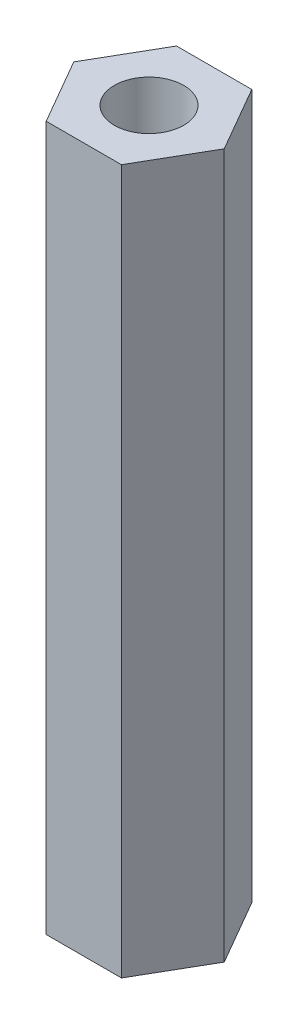
ISO-10303-21;
HEADER;
FILE_DESCRIPTION(('STEP AP214'),'2;1');
FILE_NAME('part.step','',(''),(''),'','','');
FILE_SCHEMA(('AUTOMOTIVE_DESIGN { 1 0 10303 214 1 1 1 1 }'));
ENDSEC;
DATA;
#1=APPLICATION_CONTEXT('core data for automotive mechanical design processes');
#2=APPLICATION_PROTOCOL_DEFINITION('international standard','automotive_design',2000,#1);
#3=PRODUCT_CONTEXT('',#1,'mechanical');
#4=PRODUCT('Part','Part','',(#3));
#5=PRODUCT_RELATED_PRODUCT_CATEGORY('part','',(#4));
#6=PRODUCT_DEFINITION_FORMATION('','',#4);
#7=PRODUCT_DEFINITION_CONTEXT('part definition',#1,'design');
#8=PRODUCT_DEFINITION('design','',#6,#7);
#9=PRODUCT_DEFINITION_SHAPE('','',#8);
#10=(LENGTH_UNIT() NAMED_UNIT(*) SI_UNIT(.MILLI.,.METRE.));
#11=(NAMED_UNIT(*) PLANE_ANGLE_UNIT() SI_UNIT($,.RADIAN.));
#12=(NAMED_UNIT(*) SI_UNIT($,.STERADIAN.) SOLID_ANGLE_UNIT());
#13=UNCERTAINTY_MEASURE_WITH_UNIT(LENGTH_MEASURE(1.E-05),#10,'distance_accuracy_value','');
#14=(GEOMETRIC_REPRESENTATION_CONTEXT(3) GLOBAL_UNCERTAINTY_ASSIGNED_CONTEXT((#13)) GLOBAL_UNIT_ASSIGNED_CONTEXT((#10,
#11,#12)) REPRESENTATION_CONTEXT('',''));
#15=CARTESIAN_POINT('',(0.,0.,0.));
#16=DIRECTION('',(0.,0.,1.));
#17=DIRECTION('',(1.,0.,0.));
#18=AXIS2_PLACEMENT_3D('',#15,#16,#17);
#19=CARTESIAN_POINT('',(0.,25.4,0.));
#20=DIRECTION('',(0.,1.,0.));
#21=DIRECTION('',(0.,0.,1.));
#22=AXIS2_PLACEMENT_3D('',#19,#20,#21);
#23=PLANE('',#22);
#24=DIRECTION('',(-0.5,0.,-0.866025403784439));
#25=VECTOR('',#24,1.);
#26=CARTESIAN_POINT('',(2.71354626519124,25.4,0.));
#27=LINE('',#26,#25);
#28=CARTESIAN_POINT('',(2.71354626519124,25.4,0.));
#29=VERTEX_POINT('',#28);
#30=CARTESIAN_POINT('',(1.35677313259562,25.4,-2.35));
#31=VERTEX_POINT('',#30);
#32=EDGE_CURVE('E129',#29,#31,#27,.T.);
#33=ORIENTED_EDGE('',*,*,#32,.T.);
#34=DIRECTION('',(-1.,0.,0.));
#35=VECTOR('',#34,1.);
#36=CARTESIAN_POINT('',(1.35677313259562,25.4,-2.35));
#37=LINE('',#36,#35);
#38=CARTESIAN_POINT('',(-1.35677313259562,25.4,-2.35));
#39=VERTEX_POINT('',#38);
#40=EDGE_CURVE('E87',#31,#39,#37,.T.);
#41=ORIENTED_EDGE('',*,*,#40,.T.);
#42=DIRECTION('',(-0.5,0.,0.866025403784439));
#43=VECTOR('',#42,1.);
#44=CARTESIAN_POINT('',(-1.35677313259562,25.4,-2.35));
#45=LINE('',#44,#43);
#46=CARTESIAN_POINT('',(-2.71354626519124,25.4,0.));
#47=VERTEX_POINT('',#46);
#48=EDGE_CURVE('E100',#39,#47,#45,.T.);
#49=ORIENTED_EDGE('',*,*,#48,.T.);
#50=DIRECTION('',(0.5,0.,0.866025403784439));
#51=VECTOR('',#50,1.);
#52=CARTESIAN_POINT('',(-2.71354626519124,25.4,0.));
#53=LINE('',#52,#51);
#54=CARTESIAN_POINT('',(-1.35677313259562,25.4,2.35));
#55=VERTEX_POINT('',#54);
#56=EDGE_CURVE('E94',#47,#55,#53,.T.);
#57=ORIENTED_EDGE('',*,*,#56,.T.);
#58=DIRECTION('',(1.,0.,0.));
#59=VECTOR('',#58,1.);
#60=CARTESIAN_POINT('',(-1.35677313259562,25.4,2.35));
#61=LINE('',#60,#59);
#62=CARTESIAN_POINT('',(1.35677313259562,25.4,2.35));
#63=VERTEX_POINT('',#62);
#64=EDGE_CURVE('E98',#55,#63,#61,.T.);
#65=ORIENTED_EDGE('',*,*,#64,.T.);
#66=DIRECTION('',(0.5,0.,-0.866025403784439));
#67=VECTOR('',#66,1.);
#68=CARTESIAN_POINT('',(1.35677313259562,25.4,2.35));
#69=LINE('',#68,#67);
#70=EDGE_CURVE('E50',#63,#29,#69,.T.);
#71=ORIENTED_EDGE('',*,*,#70,.T.);
#72=EDGE_LOOP('',(#33,#41,#49,#57,#65,#71));
#73=FACE_BOUND('',#72,.T.);
#74=CARTESIAN_POINT('',(0.,25.4,0.));
#75=DIRECTION('',(0.,1.,0.));
#76=DIRECTION('',(0.,0.,1.));
#77=AXIS2_PLACEMENT_3D('',#74,#75,#76);
#78=CIRCLE('',#77,1.25);
#79=CARTESIAN_POINT('',(0.,25.4,1.25));
#80=VERTEX_POINT('',#79);
#81=EDGE_CURVE('E122',#80,#80,#78,.T.);
#82=ORIENTED_EDGE('',*,*,#81,.F.);
#83=EDGE_LOOP('',(#82));
#84=FACE_BOUND('',#83,.T.);
#85=ADVANCED_FACE('F33',(#73,#84),#23,.T.);
#86=CARTESIAN_POINT('',(0.,0.,0.));
#87=DIRECTION('',(0.,1.,0.));
#88=DIRECTION('',(0.,0.,1.));
#89=AXIS2_PLACEMENT_3D('',#86,#87,#88);
#90=PLANE('',#89);
#91=DIRECTION('',(-0.5,0.,-0.866025403784439));
#92=VECTOR('',#91,1.);
#93=CARTESIAN_POINT('',(2.71354626519124,0.,0.));
#94=LINE('',#93,#92);
#95=CARTESIAN_POINT('',(2.71354626519124,0.,0.));
#96=VERTEX_POINT('',#95);
#97=CARTESIAN_POINT('',(1.35677313259562,0.,-2.35));
#98=VERTEX_POINT('',#97);
#99=EDGE_CURVE('E118',#96,#98,#94,.T.);
#100=ORIENTED_EDGE('',*,*,#99,.F.);
#101=DIRECTION('',(0.5,0.,-0.866025403784439));
#102=VECTOR('',#101,1.);
#103=CARTESIAN_POINT('',(1.35677313259562,0.,2.35));
#104=LINE('',#103,#102);
#105=CARTESIAN_POINT('',(1.35677313259562,0.,2.35));
#106=VERTEX_POINT('',#105);
#107=EDGE_CURVE('E79',#106,#96,#104,.T.);
#108=ORIENTED_EDGE('',*,*,#107,.F.);
#109=DIRECTION('',(1.,0.,0.));
#110=VECTOR('',#109,1.);
#111=CARTESIAN_POINT('',(-1.35677313259562,0.,2.35));
#112=LINE('',#111,#110);
#113=CARTESIAN_POINT('',(-1.35677313259562,0.,2.35));
#114=VERTEX_POINT('',#113);
#115=EDGE_CURVE('E73',#114,#106,#112,.T.);
#116=ORIENTED_EDGE('',*,*,#115,.F.);
#117=DIRECTION('',(0.5,0.,0.866025403784439));
#118=VECTOR('',#117,1.);
#119=CARTESIAN_POINT('',(-2.71354626519124,0.,0.));
#120=LINE('',#119,#118);
#121=CARTESIAN_POINT('',(-2.71354626519124,0.,0.));
#122=VERTEX_POINT('',#121);
#123=EDGE_CURVE('E108',#122,#114,#120,.T.);
#124=ORIENTED_EDGE('',*,*,#123,.F.);
#125=DIRECTION('',(-0.5,0.,0.866025403784439));
#126=VECTOR('',#125,1.);
#127=CARTESIAN_POINT('',(-1.35677313259562,0.,-2.35));
#128=LINE('',#127,#126);
#129=CARTESIAN_POINT('',(-1.35677313259562,0.,-2.35));
#130=VERTEX_POINT('',#129);
#131=EDGE_CURVE('E124',#130,#122,#128,.T.);
#132=ORIENTED_EDGE('',*,*,#131,.F.);
#133=DIRECTION('',(-1.,0.,0.));
#134=VECTOR('',#133,1.);
#135=CARTESIAN_POINT('',(1.35677313259562,0.,-2.35));
#136=LINE('',#135,#134);
#137=EDGE_CURVE('E121',#98,#130,#136,.T.);
#138=ORIENTED_EDGE('',*,*,#137,.F.);
#139=EDGE_LOOP('',(#100,#108,#116,#124,#132,#138));
#140=FACE_BOUND('',#139,.T.);
#141=CARTESIAN_POINT('',(0.,0.,0.));
#142=DIRECTION('',(0.,1.,0.));
#143=DIRECTION('',(0.,0.,1.));
#144=AXIS2_PLACEMENT_3D('',#141,#142,#143);
#145=CIRCLE('',#144,1.25);
#146=CARTESIAN_POINT('',(0.,0.,1.25));
#147=VERTEX_POINT('',#146);
#148=EDGE_CURVE('E222',#147,#147,#145,.T.);
#149=ORIENTED_EDGE('',*,*,#148,.T.);
#150=EDGE_LOOP('',(#149));
#151=FACE_BOUND('',#150,.T.);
#152=ADVANCED_FACE('F138',(#140,#151),#90,.F.);
#153=CARTESIAN_POINT('',(2.71354626519124,25.4,0.));
#154=DIRECTION('',(-0.866025403784439,0.,0.5));
#155=DIRECTION('',(0.5,0.,0.866025403784439));
#156=AXIS2_PLACEMENT_3D('',#153,#154,#155);
#157=PLANE('',#156);
#158=ORIENTED_EDGE('',*,*,#99,.T.);
#159=DIRECTION('',(0.,-1.,0.));
#160=VECTOR('',#159,1.);
#161=CARTESIAN_POINT('',(1.35677313259562,25.4,-2.35));
#162=LINE('',#161,#160);
#163=EDGE_CURVE('E11',#31,#98,#162,.T.);
#164=ORIENTED_EDGE('',*,*,#163,.F.);
#165=ORIENTED_EDGE('',*,*,#32,.F.);
#166=DIRECTION('',(0.,-1.,0.));
#167=VECTOR('',#166,1.);
#168=CARTESIAN_POINT('',(2.71354626519124,25.4,0.));
#169=LINE('',#168,#167);
#170=EDGE_CURVE('E114',#29,#96,#169,.T.);
#171=ORIENTED_EDGE('',*,*,#170,.T.);
#172=EDGE_LOOP('',(#158,#164,#165,#171));
#173=FACE_BOUND('',#172,.T.);
#174=ADVANCED_FACE('F35',(#173),#157,.F.);
#175=CARTESIAN_POINT('',(1.35677313259562,25.4,-2.35));
#176=DIRECTION('',(0.,0.,1.));
#177=DIRECTION('',(1.,0.,0.));
#178=AXIS2_PLACEMENT_3D('',#175,#176,#177);
#179=PLANE('',#178);
#180=ORIENTED_EDGE('',*,*,#137,.T.);
#181=DIRECTION('',(0.,-1.,0.));
#182=VECTOR('',#181,1.);
#183=CARTESIAN_POINT('',(-1.35677313259562,25.4,-2.35));
#184=LINE('',#183,#182);
#185=EDGE_CURVE('E42',#39,#130,#184,.T.);
#186=ORIENTED_EDGE('',*,*,#185,.F.);
#187=ORIENTED_EDGE('',*,*,#40,.F.);
#188=ORIENTED_EDGE('',*,*,#163,.T.);
#189=EDGE_LOOP('',(#180,#186,#187,#188));
#190=FACE_BOUND('',#189,.T.);
#191=ADVANCED_FACE('F163',(#190),#179,.F.);
#192=CARTESIAN_POINT('',(-1.35677313259562,25.4,-2.35));
#193=DIRECTION('',(0.866025403784439,0.,0.5));
#194=DIRECTION('',(0.5,0.,-0.866025403784439));
#195=AXIS2_PLACEMENT_3D('',#192,#193,#194);
#196=PLANE('',#195);
#197=ORIENTED_EDGE('',*,*,#131,.T.);
#198=DIRECTION('',(0.,-1.,0.));
#199=VECTOR('',#198,1.);
#200=CARTESIAN_POINT('',(-2.71354626519124,25.4,0.));
#201=LINE('',#200,#199);
#202=EDGE_CURVE('E109',#47,#122,#201,.T.);
#203=ORIENTED_EDGE('',*,*,#202,.F.);
#204=ORIENTED_EDGE('',*,*,#48,.F.);
#205=ORIENTED_EDGE('',*,*,#185,.T.);
#206=EDGE_LOOP('',(#197,#203,#204,#205));
#207=FACE_BOUND('',#206,.T.);
#208=ADVANCED_FACE('F135',(#207),#196,.F.);
#209=CARTESIAN_POINT('',(-2.71354626519124,25.4,0.));
#210=DIRECTION('',(0.866025403784439,0.,-0.5));
#211=DIRECTION('',(-0.5,0.,-0.866025403784439));
#212=AXIS2_PLACEMENT_3D('',#209,#210,#211);
#213=PLANE('',#212);
#214=ORIENTED_EDGE('',*,*,#123,.T.);
#215=DIRECTION('',(0.,-1.,0.));
#216=VECTOR('',#215,1.);
#217=CARTESIAN_POINT('',(-1.35677313259562,25.4,2.35));
#218=LINE('',#217,#216);
#219=EDGE_CURVE('E105',#55,#114,#218,.T.);
#220=ORIENTED_EDGE('',*,*,#219,.F.);
#221=ORIENTED_EDGE('',*,*,#56,.F.);
#222=ORIENTED_EDGE('',*,*,#202,.T.);
#223=EDGE_LOOP('',(#214,#220,#221,#222));
#224=FACE_BOUND('',#223,.T.);
#225=ADVANCED_FACE('F106',(#224),#213,.F.);
#226=CARTESIAN_POINT('',(-1.35677313259562,25.4,2.35));
#227=DIRECTION('',(0.,0.,-1.));
#228=DIRECTION('',(-1.,0.,0.));
#229=AXIS2_PLACEMENT_3D('',#226,#227,#228);
#230=PLANE('',#229);
#231=ORIENTED_EDGE('',*,*,#115,.T.);
#232=DIRECTION('',(0.,-1.,0.));
#233=VECTOR('',#232,1.);
#234=CARTESIAN_POINT('',(1.35677313259562,25.4,2.35));
#235=LINE('',#234,#233);
#236=EDGE_CURVE('E110',#63,#106,#235,.T.);
#237=ORIENTED_EDGE('',*,*,#236,.F.);
#238=ORIENTED_EDGE('',*,*,#64,.F.);
#239=ORIENTED_EDGE('',*,*,#219,.T.);
#240=EDGE_LOOP('',(#231,#237,#238,#239));
#241=FACE_BOUND('',#240,.T.);
#242=ADVANCED_FACE('F112',(#241),#230,.F.);
#243=CARTESIAN_POINT('',(1.35677313259562,25.4,2.35));
#244=DIRECTION('',(-0.866025403784439,0.,-0.5));
#245=DIRECTION('',(-0.5,0.,0.866025403784439));
#246=AXIS2_PLACEMENT_3D('',#243,#244,#245);
#247=PLANE('',#246);
#248=ORIENTED_EDGE('',*,*,#107,.T.);
#249=ORIENTED_EDGE('',*,*,#170,.F.);
#250=ORIENTED_EDGE('',*,*,#70,.F.);
#251=ORIENTED_EDGE('',*,*,#236,.T.);
#252=EDGE_LOOP('',(#248,#249,#250,#251));
#253=FACE_BOUND('',#252,.T.);
#254=ADVANCED_FACE('F143',(#253),#247,.F.);
#255=CARTESIAN_POINT('',(0.,25.4,0.));
#256=DIRECTION('',(0.,-1.,0.));
#257=DIRECTION('',(0.,0.,-1.));
#258=AXIS2_PLACEMENT_3D('',#255,#256,#257);
#259=CYLINDRICAL_SURFACE('',#258,1.25);
#260=ORIENTED_EDGE('',*,*,#81,.T.);
#261=EDGE_LOOP('',(#260));
#262=FACE_BOUND('',#261,.T.);
#263=ORIENTED_EDGE('',*,*,#148,.F.);
#264=EDGE_LOOP('',(#263));
#265=FACE_BOUND('',#264,.T.);
#266=ADVANCED_FACE('F145',(#262,#265),#259,.F.);
#267=CLOSED_SHELL('',(#85,#152,#174,#191,#208,#225,#242,#254,#266));
#268=MANIFOLD_SOLID_BREP('B2',#267);
#269=ADVANCED_BREP_SHAPE_REPRESENTATION('',(#18,#268),#14);
#270=SHAPE_DEFINITION_REPRESENTATION(#9,#269);
ENDSEC;
END-ISO-10303-21;
